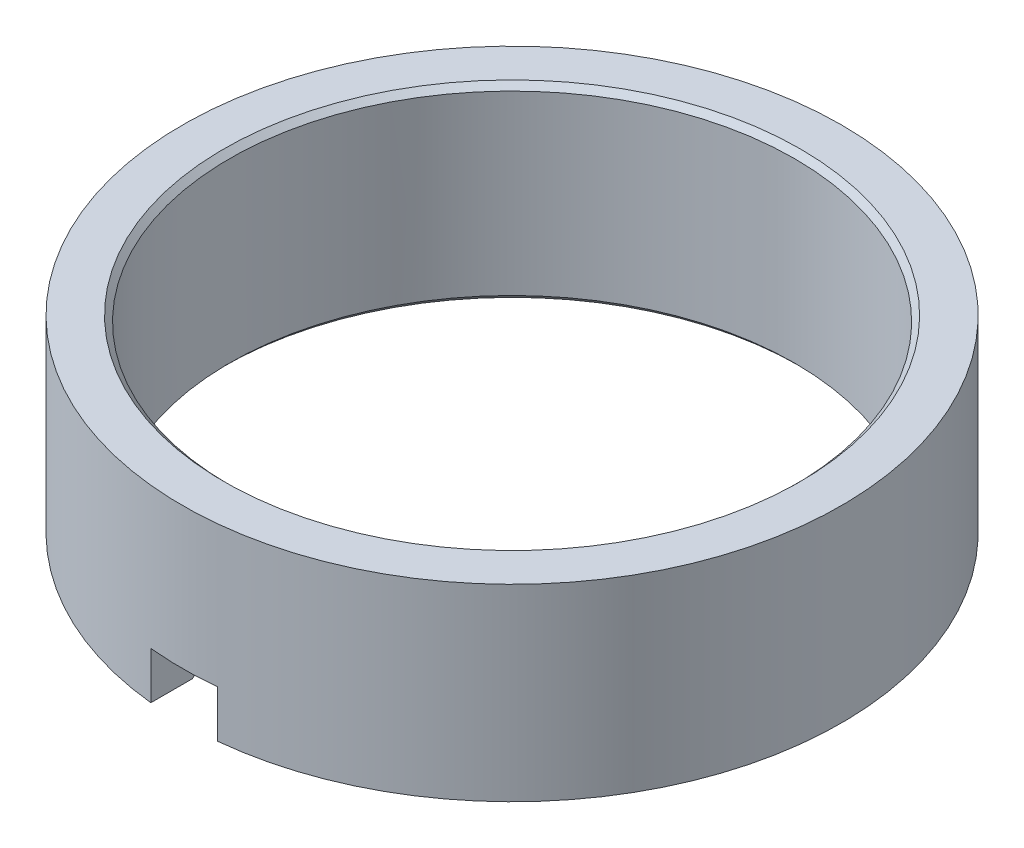
ISO-10303-21;
HEADER;
FILE_DESCRIPTION(('STEP AP214'),'2;1');
FILE_NAME('part.step','',(''),(''),'','','');
FILE_SCHEMA(('AUTOMOTIVE_DESIGN { 1 0 10303 214 1 1 1 1 }'));
ENDSEC;
DATA;
#1=APPLICATION_CONTEXT('core data for automotive mechanical design processes');
#2=APPLICATION_PROTOCOL_DEFINITION('international standard','automotive_design',2000,#1);
#3=PRODUCT_CONTEXT('',#1,'mechanical');
#4=PRODUCT('Part','Part','',(#3));
#5=PRODUCT_RELATED_PRODUCT_CATEGORY('part','',(#4));
#6=PRODUCT_DEFINITION_FORMATION('','',#4);
#7=PRODUCT_DEFINITION_CONTEXT('part definition',#1,'design');
#8=PRODUCT_DEFINITION('design','',#6,#7);
#9=PRODUCT_DEFINITION_SHAPE('','',#8);
#10=(LENGTH_UNIT() NAMED_UNIT(*) SI_UNIT(.MILLI.,.METRE.));
#11=(NAMED_UNIT(*) PLANE_ANGLE_UNIT() SI_UNIT($,.RADIAN.));
#12=(NAMED_UNIT(*) SI_UNIT($,.STERADIAN.) SOLID_ANGLE_UNIT());
#13=UNCERTAINTY_MEASURE_WITH_UNIT(LENGTH_MEASURE(1.E-05),#10,'distance_accuracy_value','');
#14=(GEOMETRIC_REPRESENTATION_CONTEXT(3) GLOBAL_UNCERTAINTY_ASSIGNED_CONTEXT((#13)) GLOBAL_UNIT_ASSIGNED_CONTEXT((#10,
#11,#12)) REPRESENTATION_CONTEXT('',''));
#15=CARTESIAN_POINT('',(0.,0.,0.));
#16=DIRECTION('',(0.,0.,1.));
#17=DIRECTION('',(1.,0.,0.));
#18=AXIS2_PLACEMENT_3D('',#15,#16,#17);
#19=CARTESIAN_POINT('',(-114.3254,-38.1,0.));
#20=DIRECTION('',(0.,1.,0.));
#21=DIRECTION('',(0.,0.,1.));
#22=AXIS2_PLACEMENT_3D('',#19,#20,#21);
#23=PLANE('',#22);
#24=DIRECTION('',(0.,0.,-1.));
#25=VECTOR('',#24,1.);
#26=CARTESIAN_POINT('',(13.4874,-38.1,0.));
#27=LINE('',#26,#25);
#28=CARTESIAN_POINT('',(13.4874,-38.1,132.666169543105));
#29=VERTEX_POINT('',#28);
#30=CARTESIAN_POINT('',(13.4874,-38.1,115.82879025182));
#31=VERTEX_POINT('',#30);
#32=EDGE_CURVE('E92',#29,#31,#27,.T.);
#33=ORIENTED_EDGE('',*,*,#32,.T.);
#34=CARTESIAN_POINT('',(0.,-38.1,0.));
#35=DIRECTION('',(0.,1.,0.));
#36=DIRECTION('',(0.,0.,1.));
#37=AXIS2_PLACEMENT_3D('',#34,#35,#36);
#38=CIRCLE('',#37,116.6114);
#39=CARTESIAN_POINT('',(-13.4874,-38.1,115.82879025182));
#40=VERTEX_POINT('',#39);
#41=EDGE_CURVE('E125',#31,#40,#38,.T.);
#42=ORIENTED_EDGE('',*,*,#41,.T.);
#43=DIRECTION('',(0.,0.,1.));
#44=VECTOR('',#43,1.);
#45=CARTESIAN_POINT('',(-13.4874,-38.1,0.));
#46=LINE('',#45,#44);
#47=CARTESIAN_POINT('',(-13.4874,-38.1,132.666169543105));
#48=VERTEX_POINT('',#47);
#49=EDGE_CURVE('E62',#40,#48,#46,.T.);
#50=ORIENTED_EDGE('',*,*,#49,.T.);
#51=CARTESIAN_POINT('',(0.,-38.1,0.));
#52=DIRECTION('',(0.,-1.,0.));
#53=DIRECTION('',(0.,0.,-1.));
#54=AXIS2_PLACEMENT_3D('',#51,#52,#53);
#55=CIRCLE('',#54,133.35);
#56=EDGE_CURVE('E107',#48,#29,#55,.T.);
#57=ORIENTED_EDGE('',*,*,#56,.T.);
#58=EDGE_LOOP('',(#33,#42,#50,#57));
#59=FACE_BOUND('',#58,.T.);
#60=ADVANCED_FACE('F45',(#59),#23,.F.);
#61=CARTESIAN_POINT('',(0.,-63.5,0.));
#62=DIRECTION('',(0.,-1.,0.));
#63=DIRECTION('',(0.,0.,-1.));
#64=AXIS2_PLACEMENT_3D('',#61,#62,#63);
#65=CYLINDRICAL_SURFACE('',#64,133.35);
#66=CARTESIAN_POINT('',(0.,38.1,0.));
#67=DIRECTION('',(0.,-1.,0.));
#68=DIRECTION('',(0.,0.,-1.));
#69=AXIS2_PLACEMENT_3D('',#66,#67,#68);
#70=CIRCLE('',#69,133.35);
#71=CARTESIAN_POINT('',(0.,38.1,-133.35));
#72=VERTEX_POINT('',#71);
#73=EDGE_CURVE('E111',#72,#72,#70,.T.);
#74=ORIENTED_EDGE('',*,*,#73,.T.);
#75=EDGE_LOOP('',(#74));
#76=FACE_BOUND('',#75,.T.);
#77=DIRECTION('',(0.,-1.,0.));
#78=VECTOR('',#77,1.);
#79=CARTESIAN_POINT('',(13.4874,-63.5,132.666169543105));
#80=LINE('',#79,#78);
#81=CARTESIAN_POINT('',(13.4874,-19.05,132.666169543105));
#82=VERTEX_POINT('',#81);
#83=EDGE_CURVE('E95',#29,#82,#80,.F.);
#84=ORIENTED_EDGE('',*,*,#83,.F.);
#85=ORIENTED_EDGE('',*,*,#56,.F.);
#86=DIRECTION('',(0.,-1.,0.));
#87=VECTOR('',#86,1.);
#88=CARTESIAN_POINT('',(-13.4874,-63.5,132.666169543105));
#89=LINE('',#88,#87);
#90=CARTESIAN_POINT('',(-13.4874,-19.05,132.666169543105));
#91=VERTEX_POINT('',#90);
#92=EDGE_CURVE('E177',#91,#48,#89,.T.);
#93=ORIENTED_EDGE('',*,*,#92,.F.);
#94=CARTESIAN_POINT('',(0.,-19.05,0.));
#95=DIRECTION('',(0.,-1.,0.));
#96=DIRECTION('',(0.,0.,-1.));
#97=AXIS2_PLACEMENT_3D('',#94,#95,#96);
#98=CIRCLE('',#97,133.35);
#99=EDGE_CURVE('E108',#82,#91,#98,.T.);
#100=ORIENTED_EDGE('',*,*,#99,.F.);
#101=EDGE_LOOP('',(#84,#85,#93,#100));
#102=FACE_BOUND('',#101,.T.);
#103=ADVANCED_FACE('F105',(#76,#102),#65,.T.);
#104=CARTESIAN_POINT('',(0.,-63.5,0.));
#105=DIRECTION('',(0.,-1.,0.));
#106=DIRECTION('',(0.,0.,-1.));
#107=AXIS2_PLACEMENT_3D('',#104,#105,#106);
#108=CYLINDRICAL_SURFACE('',#107,114.3254);
#109=CARTESIAN_POINT('',(0.,35.8139999999999,0.));
#110=DIRECTION('',(0.,-1.,0.));
#111=DIRECTION('',(0.,0.,-1.));
#112=AXIS2_PLACEMENT_3D('',#109,#110,#111);
#113=CIRCLE('',#112,114.3254);
#114=CARTESIAN_POINT('',(0.,35.8139999999999,-114.3254));
#115=VERTEX_POINT('',#114);
#116=EDGE_CURVE('E122',#115,#115,#113,.F.);
#117=ORIENTED_EDGE('',*,*,#116,.T.);
#118=EDGE_LOOP('',(#117));
#119=FACE_BOUND('',#118,.T.);
#120=DIRECTION('',(0.,-1.,0.));
#121=VECTOR('',#120,1.);
#122=CARTESIAN_POINT('',(13.4874,-63.5,113.52703257991));
#123=LINE('',#122,#121);
#124=CARTESIAN_POINT('',(13.4874,-19.05,113.52703257991));
#125=VERTEX_POINT('',#124);
#126=CARTESIAN_POINT('',(13.4874,-35.8139999999999,113.52703257991));
#127=VERTEX_POINT('',#126);
#128=EDGE_CURVE('E70',#125,#127,#123,.T.);
#129=ORIENTED_EDGE('',*,*,#128,.F.);
#130=CARTESIAN_POINT('',(0.,-19.05,0.));
#131=DIRECTION('',(0.,-1.,0.));
#132=DIRECTION('',(0.,0.,-1.));
#133=AXIS2_PLACEMENT_3D('',#130,#131,#132);
#134=CIRCLE('',#133,114.3254);
#135=CARTESIAN_POINT('',(-13.4874,-19.05,113.52703257991));
#136=VERTEX_POINT('',#135);
#137=EDGE_CURVE('E11',#136,#125,#134,.F.);
#138=ORIENTED_EDGE('',*,*,#137,.F.);
#139=DIRECTION('',(0.,-1.,0.));
#140=VECTOR('',#139,1.);
#141=CARTESIAN_POINT('',(-13.4874,-63.5,113.52703257991));
#142=LINE('',#141,#140);
#143=CARTESIAN_POINT('',(-13.4874,-35.8139999999999,113.52703257991));
#144=VERTEX_POINT('',#143);
#145=EDGE_CURVE('E179',#144,#136,#142,.F.);
#146=ORIENTED_EDGE('',*,*,#145,.F.);
#147=CARTESIAN_POINT('',(0.,-35.8139999999999,0.));
#148=DIRECTION('',(0.,1.,0.));
#149=DIRECTION('',(0.,0.,1.));
#150=AXIS2_PLACEMENT_3D('',#147,#148,#149);
#151=CIRCLE('',#150,114.3254);
#152=EDGE_CURVE('E114',#144,#127,#151,.F.);
#153=ORIENTED_EDGE('',*,*,#152,.T.);
#154=EDGE_LOOP('',(#129,#138,#146,#153));
#155=FACE_BOUND('',#154,.T.);
#156=ADVANCED_FACE('F146',(#119,#155),#108,.F.);
#157=CARTESIAN_POINT('',(0.,-35.8139999999999,0.));
#158=DIRECTION('',(0.,-1.,0.));
#159=DIRECTION('',(0.,0.,-1.));
#160=AXIS2_PLACEMENT_3D('',#157,#158,#159);
#161=CONICAL_SURFACE('',#160,114.3254,0.785398163397454);
#162=ORIENTED_EDGE('',*,*,#41,.F.);
#163=CARTESIAN_POINT('',(13.4874,-154.734004730704,232.855124206513));
#164=CARTESIAN_POINT('',(13.4874,-150.783306227103,228.897800791618));
#165=CARTESIAN_POINT('',(13.4874,-146.832772893592,224.94031247727));
#166=CARTESIAN_POINT('',(13.4874,-138.932101825906,217.024940736671));
#167=CARTESIAN_POINT('',(13.4874,-134.981964091744,213.067057310407));
#168=CARTESIAN_POINT('',(13.4874,-123.132146557052,201.19262057548));
#169=CARTESIAN_POINT('',(13.4874,-115.23315844091,193.275376981933));
#170=CARTESIAN_POINT('',(13.4874,-99.435655904682,177.436123165166));
#171=CARTESIAN_POINT('',(13.4874,-91.5371421970808,169.514112231245));
#172=CARTESIAN_POINT('',(13.4874,-79.6924009431494,157.628169552292));
#173=CARTESIAN_POINT('',(13.4874,-75.7446818781519,153.665724185155));
#174=CARTESIAN_POINT('',(13.4874,-67.8505063106045,145.739578018422));
#175=CARTESIAN_POINT('',(13.4874,-63.9040498077181,141.775877219161));
#176=CARTESIAN_POINT('',(13.4874,-55.8711285886484,133.704578006174));
#177=CARTESIAN_POINT('',(13.4874,-51.784722702562,129.596921038157));
#178=CARTESIAN_POINT('',(13.4874,-43.6141885995613,121.379333818063));
#179=CARTESIAN_POINT('',(13.4874,-39.5300603849835,117.269403563663));
#180=CARTESIAN_POINT('',(13.4874,-31.3647597146804,109.046308919736));
#181=CARTESIAN_POINT('',(13.4874,-27.2835873726008,104.93314441735));
#182=CARTESIAN_POINT('',(13.4874,-19.1256116030581,96.7025130745335));
#183=CARTESIAN_POINT('',(13.4874,-15.0488081597221,92.5850462498418));
#184=CARTESIAN_POINT('',(13.4874,-8.93879955870933,86.4044135691978));
#185=CARTESIAN_POINT('',(13.4874,-6.90317207712611,84.3436424858579));
#186=CARTESIAN_POINT('',(13.4874,-2.83393731714736,80.2201067001221));
#187=CARTESIAN_POINT('',(13.4874,-0.800330038637004,78.1573419978394));
#188=CARTESIAN_POINT('',(13.4874,3.26437600555867,74.0292822938904));
#189=CARTESIAN_POINT('',(13.4874,5.29547473405966,71.9639872555997));
#190=CARTESIAN_POINT('',(13.4874,8.33966708476196,68.8636356285423));
#191=CARTESIAN_POINT('',(13.4874,9.35398804264273,67.8297841215373));
#192=CARTESIAN_POINT('',(13.4874,11.3816897272019,65.7611581265697));
#193=CARTESIAN_POINT('',(13.4874,12.3950704532538,64.726383637993));
#194=CARTESIAN_POINT('',(13.4874,15.4334684578854,61.6206144009531));
#195=CARTESIAN_POINT('',(13.4874,17.4568724473857,59.5480406496921));
#196=CARTESIAN_POINT('',(13.4874,21.4978909600851,55.3972569043069));
#197=CARTESIAN_POINT('',(13.4874,23.515505490552,53.3190469172644));
#198=CARTESIAN_POINT('',(13.4874,26.535796326691,50.1958464898754));
#199=CARTESIAN_POINT('',(13.4874,27.5415272413634,49.1538101024789));
#200=CARTESIAN_POINT('',(13.4874,29.5505248402633,47.0673650331691));
#201=CARTESIAN_POINT('',(13.4874,30.5537915261667,46.02295635287));
#202=CARTESIAN_POINT('',(13.4874,32.557325418996,43.9312785625414));
#203=CARTESIAN_POINT('',(13.4874,33.5575926458461,42.8840094716011));
#204=CARTESIAN_POINT('',(13.4874,35.5544366020842,40.7859599271183));
#205=CARTESIAN_POINT('',(13.4874,36.5510133391921,39.7351794809298));
#206=CARTESIAN_POINT('',(13.4874,37.8125336994979,38.399171689328));
#207=CARTESIAN_POINT('',(13.4874,38.079626553293,38.1159728760801));
#208=CARTESIAN_POINT('',(13.4874,38.6134538387754,37.5492372091962));
#209=CARTESIAN_POINT('',(13.4874,38.8801882701821,37.2657003552959));
#210=CARTESIAN_POINT('',(13.4874,39.6798197596355,36.4145504597994));
#211=CARTESIAN_POINT('',(13.4874,40.2121440902676,35.8463990612159));
#212=CARTESIAN_POINT('',(13.4874,41.2750534074583,34.7084548493509));
#213=CARTESIAN_POINT('',(13.4874,41.8056383670644,34.1386620108888));
#214=CARTESIAN_POINT('',(13.4874,42.8647953272733,32.9972082448155));
#215=CARTESIAN_POINT('',(13.4874,43.3933673286189,32.4255473178936));
#216=CARTESIAN_POINT('',(13.4874,44.4463160867135,31.2820957546902));
#217=CARTESIAN_POINT('',(13.4874,44.9707010654061,30.7103126926346));
#218=CARTESIAN_POINT('',(13.4874,46.0167622920154,29.5642744105434));
#219=CARTESIAN_POINT('',(13.4874,46.5384385436055,28.9900191938625));
#220=CARTESIAN_POINT('',(13.4874,47.5785853702535,27.8386428551079));
#221=CARTESIAN_POINT('',(13.4874,48.0970560430975,27.2615218214339));
#222=CARTESIAN_POINT('',(13.4874,49.1301991483985,26.103891546275));
#223=CARTESIAN_POINT('',(13.4874,49.6448715930555,25.5233823156838));
#224=CARTESIAN_POINT('',(13.4874,50.8434732587169,24.1607577651203));
#225=CARTESIAN_POINT('',(13.4874,51.5255962013884,23.3770509118857));
#226=CARTESIAN_POINT('',(13.4874,52.8792924607404,21.8004297460179));
#227=CARTESIAN_POINT('',(13.4874,53.5508648766172,21.0075146571301));
#228=CARTESIAN_POINT('',(13.4874,54.5497200984334,19.8066060257042));
#229=CARTESIAN_POINT('',(13.4874,54.8823286253909,19.4030411163719));
#230=CARTESIAN_POINT('',(13.4874,55.5432938356535,18.5924470309747));
#231=CARTESIAN_POINT('',(13.4874,55.8716505658318,18.1854178931826));
#232=CARTESIAN_POINT('',(13.4874,56.5232735596788,17.3674648318092));
#233=CARTESIAN_POINT('',(13.4874,56.8465410644358,16.9565418982108));
#234=CARTESIAN_POINT('',(13.4874,57.4871104763211,16.1300650770537));
#235=CARTESIAN_POINT('',(13.4874,57.804412387048,15.7145111922887));
#236=CARTESIAN_POINT('',(13.4874,58.4360053006716,14.8724613013077));
#237=CARTESIAN_POINT('',(13.4874,58.7502004881337,14.4458932691237));
#238=CARTESIAN_POINT('',(13.4874,59.3696213187082,13.5862646439058));
#239=CARTESIAN_POINT('',(13.4874,59.6748468022375,13.1532039355651));
#240=CARTESIAN_POINT('',(13.4874,60.2746610248018,12.2788458800381));
#241=CARTESIAN_POINT('',(13.4874,60.569234037144,11.837537705749));
#242=CARTESIAN_POINT('',(13.4874,61.1445326515099,10.9459650614538));
#243=CARTESIAN_POINT('',(13.4874,61.4252587206737,10.4957008943071));
#244=CARTESIAN_POINT('',(13.4874,61.9667018504888,9.58895834565555));
#245=CARTESIAN_POINT('',(13.4874,62.2275819109942,9.13257788449156));
#246=CARTESIAN_POINT('',(13.4874,62.7276246720978,8.20785788174897));
#247=CARTESIAN_POINT('',(13.4874,62.9667830228176,7.73951596878378));
#248=CARTESIAN_POINT('',(13.4874,63.4167031913037,6.79071856673341));
#249=CARTESIAN_POINT('',(13.4874,63.6275365228177,6.31029736398068));
#250=CARTESIAN_POINT('',(13.4874,64.0138536631907,5.33562071215081));
#251=CARTESIAN_POINT('',(13.4874,64.1893606573905,4.84137458087585));
#252=CARTESIAN_POINT('',(13.4874,64.4831876727242,3.88208177638204));
#253=CARTESIAN_POINT('',(13.4874,64.6051209922509,3.41816553253433));
#254=CARTESIAN_POINT('',(13.4874,64.7552881842329,2.71535879048671));
#255=CARTESIAN_POINT('',(13.4874,64.79989168907,2.47990706964517));
#256=CARTESIAN_POINT('',(13.4874,64.8774673949524,2.0071079587459));
#257=CARTESIAN_POINT('',(13.4874,64.9104413120674,1.76976085366261));
#258=CARTESIAN_POINT('',(13.4874,64.9640300373658,1.29486225406664));
#259=CARTESIAN_POINT('',(13.4874,64.9847052428358,1.05731759274758));
#260=CARTESIAN_POINT('',(13.4874,65.0135605151602,0.581467309936225));
#261=CARTESIAN_POINT('',(13.4874,65.0217406821055,0.343161694554848));
#262=CARTESIAN_POINT('',(13.4874,65.0254449543282,-0.133554319038558));
#263=CARTESIAN_POINT('',(13.4874,65.0209687447507,-0.371964719709828));
#264=CARTESIAN_POINT('',(13.4874,64.9994485399841,-0.848214472698873));
#265=CARTESIAN_POINT('',(13.4874,64.9824045035531,-1.08605382314015));
#266=CARTESIAN_POINT('',(13.4874,64.9361902367557,-1.55934013513394));
#267=CARTESIAN_POINT('',(13.4874,64.9070814411429,-1.79479311285263));
#268=CARTESIAN_POINT('',(13.4874,64.8372741408127,-2.26398685707855));
#269=CARTESIAN_POINT('',(13.4874,64.7965739823162,-2.49772737437865));
#270=CARTESIAN_POINT('',(13.4874,64.6580773737701,-3.19566045308936));
#271=CARTESIAN_POINT('',(13.4874,64.5438751248721,-3.65665883437924));
#272=CARTESIAN_POINT('',(13.4874,64.2773438287674,-4.5706951412174));
#273=CARTESIAN_POINT('',(13.4874,64.1247588206933,-5.02365684749696));
#274=CARTESIAN_POINT('',(13.4874,63.8727210263734,-5.69419361629786));
#275=CARTESIAN_POINT('',(13.4874,63.7848495332518,-5.91621905381325));
#276=CARTESIAN_POINT('',(13.4874,63.602141511282,-6.35738422347281));
#277=CARTESIAN_POINT('',(13.4874,63.5073050916052,-6.57652400078464));
#278=CARTESIAN_POINT('',(13.4874,63.2356489144885,-7.18036253732351));
#279=CARTESIAN_POINT('',(13.4874,63.0521382118852,-7.56205671722232));
#280=CARTESIAN_POINT('',(13.4874,62.6689982095017,-8.31731064279733));
#281=CARTESIAN_POINT('',(13.4874,62.4693649695506,-8.69086837152017));
#282=CARTESIAN_POINT('',(13.4874,62.0566746778976,-9.43093061311275));
#283=CARTESIAN_POINT('',(13.4874,61.8436050158289,-9.79742806572377));
#284=CARTESIAN_POINT('',(13.4874,61.4065477351534,-10.5237891018354));
#285=CARTESIAN_POINT('',(13.4874,61.1825609360093,-10.8836531804646));
#286=CARTESIAN_POINT('',(13.4874,60.7246723825044,-11.5988553366855));
#287=CARTESIAN_POINT('',(13.4874,60.4907373848526,-11.9541720674442));
#288=CARTESIAN_POINT('',(13.4874,60.015219415468,-12.6596452356517));
#289=CARTESIAN_POINT('',(13.4874,59.7736363262591,-13.0098015937152));
#290=CARTESIAN_POINT('',(13.4874,59.2841526513077,-13.7054043195525));
#291=CARTESIAN_POINT('',(13.4874,59.0362552252207,-14.0508529151983));
#292=CARTESIAN_POINT('',(13.4874,58.5349968225227,-14.7377698512544));
#293=CARTESIAN_POINT('',(13.4874,58.2816357076663,-15.0792380906139));
#294=CARTESIAN_POINT('',(13.4874,57.7678696804482,-15.761822863937));
#295=CARTESIAN_POINT('',(13.4874,57.5074211510117,-16.1029065273303));
#296=CARTESIAN_POINT('',(13.4874,56.9824349111018,-16.7819149710698));
#297=CARTESIAN_POINT('',(13.4874,56.7178971440498,-17.1198397076051));
#298=CARTESIAN_POINT('',(13.4874,55.9189644970031,-18.1294795516225));
#299=CARTESIAN_POINT('',(13.4874,55.3792848323579,-18.7970146874378));
#300=CARTESIAN_POINT('',(13.4874,54.2905256114602,-20.121692729743));
#301=CARTESIAN_POINT('',(13.4874,53.7414713493505,-20.778856507314));
#302=CARTESIAN_POINT('',(13.4874,52.9116600186761,-21.7592941798184));
#303=CARTESIAN_POINT('',(13.4874,52.6340231300999,-22.0852160712655));
#304=CARTESIAN_POINT('',(13.4874,52.0768905093923,-22.7354668726079));
#305=CARTESIAN_POINT('',(13.4874,51.7973947785806,-23.0597957836339));
#306=CARTESIAN_POINT('',(13.4874,50.9687956590274,-24.0163540675692));
#307=CARTESIAN_POINT('',(13.4874,50.4173552516385,-24.6465596884291));
#308=CARTESIAN_POINT('',(13.4874,49.3093495642465,-25.9024530448257));
#309=CARTESIAN_POINT('',(13.4874,48.7527842341615,-26.5281407361052));
#310=CARTESIAN_POINT('',(13.4874,47.635421505325,-27.7757650750315));
#311=CARTESIAN_POINT('',(13.4874,47.074623951192,-28.3977015834346));
#312=CARTESIAN_POINT('',(13.4874,45.9495225396311,-29.6383890494512));
#313=CARTESIAN_POINT('',(13.4874,45.3852186922582,-30.2571400161905));
#314=CARTESIAN_POINT('',(13.4874,43.6877580992334,-32.1095239303715));
#315=CARTESIAN_POINT('',(13.4874,42.5501999925515,-33.3391236157097));
#316=CARTESIAN_POINT('',(13.4874,40.2665886869108,-35.7904090101791));
#317=CARTESIAN_POINT('',(13.4874,39.1205354282992,-37.012094663625));
#318=CARTESIAN_POINT('',(13.4874,37.395983220289,-38.8408092206915));
#319=CARTESIAN_POINT('',(13.4874,36.8198811730589,-39.4501010684048));
#320=CARTESIAN_POINT('',(13.4874,35.6662691157905,-40.667345903809));
#321=CARTESIAN_POINT('',(13.4874,35.0887591112536,-41.2752988967139));
#322=CARTESIAN_POINT('',(13.4874,33.3543722393845,-43.09740296489));
#323=CARTESIAN_POINT('',(13.4874,32.1956446938416,-44.3097925839734));
#324=CARTESIAN_POINT('',(13.4874,29.8744181994633,-46.7307612886478));
#325=CARTESIAN_POINT('',(13.4874,28.7119195698038,-47.9393406804911));
#326=CARTESIAN_POINT('',(13.4874,26.3838243754579,-50.35351216724));
#327=CARTESIAN_POINT('',(13.4874,25.2182278094314,-51.5591042608527));
#328=CARTESIAN_POINT('',(13.4874,22.8938648245349,-53.9582040350579));
#329=CARTESIAN_POINT('',(13.4874,21.7351184743397,-55.1517311649417));
#330=CARTESIAN_POINT('',(13.4874,19.4155797571326,-57.5367959051009));
#331=CARTESIAN_POINT('',(13.4874,18.254787389456,-58.7283335147297));
#332=CARTESIAN_POINT('',(13.4874,14.7698207677211,-62.3005117853793));
#333=CARTESIAN_POINT('',(13.4874,12.4431027417542,-64.678670728555));
#334=CARTESIAN_POINT('',(13.4874,7.78577906613325,-69.4292567784401));
#335=CARTESIAN_POINT('',(13.4874,5.45517541040936,-71.8016858412214));
#336=CARTESIAN_POINT('',(13.4874,0.790372469186974,-76.5429801294239));
#337=CARTESIAN_POINT('',(13.4874,-1.54382679659001,-78.9118453742524));
#338=CARTESIAN_POINT('',(13.4874,-6.7838576510692,-84.2235336998939));
#339=CARTESIAN_POINT('',(13.4874,-9.69043935578732,-87.1656166425051));
#340=CARTESIAN_POINT('',(13.4874,-15.5070548950988,-93.0470238743681));
#341=CARTESIAN_POINT('',(13.4874,-18.417089082143,-95.9863478149682));
#342=CARTESIAN_POINT('',(13.4874,-24.2550122943202,-101.878287256324));
#343=CARTESIAN_POINT('',(13.4874,-27.1829139317867,-104.83089025843));
#344=CARTESIAN_POINT('',(13.4874,-33.0402639496373,-110.733891354194));
#345=CARTESIAN_POINT('',(13.4874,-35.9697121147197,-113.684289661478));
#346=CARTESIAN_POINT('',(13.4874,-38.8998474096153,-116.634004730704));
#347=B_SPLINE_CURVE_WITH_KNOTS('',3,(#163,#164,#165,#166,#167,#168,#169,#170,#171,#172,#173,
#174,#175,#176,#177,#178,#179,#180,#181,#182,#183,#184,#185,#186,#187,#188,#189,#190,#191,#192,
#193,#194,#195,#196,#197,#198,#199,#200,#201,#202,#203,#204,#205,#206,#207,#208,#209,#210,#211,
#212,#213,#214,#215,#216,#217,#218,#219,#220,#221,#222,#223,#224,#225,#226,#227,#228,#229,#230,
#231,#232,#233,#234,#235,#236,#237,#238,#239,#240,#241,#242,#243,#244,#245,#246,#247,#248,#249,
#250,#251,#252,#253,#254,#255,#256,#257,#258,#259,#260,#261,#262,#263,#264,#265,#266,#267,#268,
#269,#270,#271,#272,#273,#274,#275,#276,#277,#278,#279,#280,#281,#282,#283,#284,#285,#286,#287,
#288,#289,#290,#291,#292,#293,#294,#295,#296,#297,#298,#299,#300,#301,#302,#303,#304,#305,#306,
#307,#308,#309,#310,#311,#312,#313,#314,#315,#316,#317,#318,#319,#320,#321,#322,#323,#324,#325,
#326,#327,#328,#329,#330,#331,#332,#333,#334,#335,#336,#337,#338,#339,#340,#341,#342,#343,#344,
#345,#346),.UNSPECIFIED.,.F.,.F.,(4,2,2,2,2,2,2,2,2,2,2,2,2,2,2,2,2,2,2,2,2,2,2,2,2,2,2,2,2,2,2,
2,2,2,2,2,2,2,2,2,2,2,2,2,2,2,2,2,2,2,2,2,2,2,2,2,2,2,2,2,2,2,2,2,2,2,2,2,2,2,2,2,2,2,2,2,2,2,2,
2,2,2,2,2,2,2,2,2,2,2,2,4),(0.,16.7754536581754,33.5509078460267,67.102223913849,
100.662660607065,117.442682205294,134.222699327617,151.604989377127,168.987297223784,
186.370241230576,203.753121866283,212.443058092003,221.132993823682,229.823056856686,
234.168083781137,238.513113599123,247.202612939477,255.892101366705,260.236751372987,
264.581398423892,268.926016550837,273.270625584208,274.438470131733,275.606315592991,
277.942010546488,280.277741523504,282.613471638612,284.940960584767,287.268446373647,
289.595860808784,291.923267764891,295.040153084832,298.157303093708,299.726177246661,
301.295034089056,302.863502221741,304.431969408265,306.02124824367,307.610555337401,
309.202120222435,310.793631377699,312.370212553138,313.947108753736,315.519945697875,
317.091746969151,318.528764578313,319.247438305963,319.966005941223,320.681015016018,
321.39601836323,322.111039497863,322.826062978883,323.537489381963,324.249017337568,
325.671790083016,327.104314696032,327.820560409065,328.536794897739,329.806841089226,
331.077198610794,332.348766664557,333.620239418367,334.896358848275,336.172497889127,
337.448010438463,338.723555299488,340.010975304043,341.298413137249,343.873460432652,
346.442408080535,347.726834223039,349.011259453703,351.523433614619,354.035632351215,
356.547923773581,359.060207994746,364.085439120641,369.110705567037,371.626289264989,
374.141863149215,379.173037923859,384.203797438123,389.234559129097,394.225027239218,
399.215496970886,409.196633540428,419.173662554717,429.15063703959,441.557753629207,
453.966269889942,466.440813136147,478.91392909322),.UNSPECIFIED.);
#348=EDGE_CURVE('E55',#31,#127,#347,.T.);
#349=ORIENTED_EDGE('',*,*,#348,.T.);
#350=ORIENTED_EDGE('',*,*,#152,.F.);
#351=CARTESIAN_POINT('',(-13.4874,-38.8998474096153,-116.634004730704));
#352=CARTESIAN_POINT('',(-13.4874,-37.3334828317347,-115.057199541472));
#353=CARTESIAN_POINT('',(-13.4874,-35.7673266104061,-113.480187366134));
#354=CARTESIAN_POINT('',(-13.4874,-32.6354917494456,-110.325687395638));
#355=CARTESIAN_POINT('',(-13.4874,-31.0698131100392,-108.748199600256));
#356=CARTESIAN_POINT('',(-13.4874,-26.3729902856855,-104.014331038644));
#357=CARTESIAN_POINT('',(-13.4874,-23.2426564022265,-100.857146191457));
#358=CARTESIAN_POINT('',(-13.4874,-16.9722593039628,-94.5272868380065));
#359=CARTESIAN_POINT('',(-13.4874,-13.8322074889674,-91.35460103618));
#360=CARTESIAN_POINT('',(-13.4874,-9.12533842452391,-86.5929854508427));
#361=CARTESIAN_POINT('',(-13.4874,-7.55706288237313,-85.0054972058659));
#362=CARTESIAN_POINT('',(-13.4874,-4.42167292682954,-81.8293890464668));
#363=CARTESIAN_POINT('',(-13.4874,-2.85455850805352,-80.240769137359));
#364=CARTESIAN_POINT('',(-13.4874,1.17755478406773,-76.1498062136203));
#365=CARTESIAN_POINT('',(-13.4874,3.64154393589919,-73.6464677535382));
#366=CARTESIAN_POINT('',(-13.4874,8.56504240786121,-68.6352805585237));
#367=CARTESIAN_POINT('',(-13.4874,11.0245516301276,-66.1274317273851));
#368=CARTESIAN_POINT('',(-13.4874,14.7099164015938,-62.3601366399749));
#369=CARTESIAN_POINT('',(-13.4874,15.93814714957,-61.1030139698593));
#370=CARTESIAN_POINT('',(-13.4874,18.3926964448373,-58.5869034484075));
#371=CARTESIAN_POINT('',(-13.4874,19.6190149926279,-57.3279155975585));
#372=CARTESIAN_POINT('',(-13.4874,22.069241054341,-54.8077932294101));
#373=CARTESIAN_POINT('',(-13.4874,23.2931487550175,-53.5466588937262));
#374=CARTESIAN_POINT('',(-13.4874,25.7381248408737,-51.0216438564329));
#375=CARTESIAN_POINT('',(-13.4874,26.9591932305107,-49.7577631591408));
#376=CARTESIAN_POINT('',(-13.4874,29.3931332244616,-47.2314342281612));
#377=CARTESIAN_POINT('',(-13.4874,30.6060183180458,-45.9689989954233));
#378=CARTESIAN_POINT('',(-13.4874,33.0273552335893,-43.4398659862809));
#379=CARTESIAN_POINT('',(-13.4874,34.2358070271941,-42.1731681827128));
#380=CARTESIAN_POINT('',(-13.4874,36.6473520186931,-39.6339091928487));
#381=CARTESIAN_POINT('',(-13.4874,37.8504433814535,-38.3613462627513));
#382=CARTESIAN_POINT('',(-13.4874,40.2490088349541,-35.8090992685306));
#383=CARTESIAN_POINT('',(-13.4874,41.4444830844418,-34.5294153538633));
#384=CARTESIAN_POINT('',(-13.4874,43.2290675381029,-32.6035381933153));
#385=CARTESIAN_POINT('',(-13.4874,43.822085356985,-31.9609657475553));
#386=CARTESIAN_POINT('',(-13.4874,45.0050301245127,-30.6729831292831));
#387=CARTESIAN_POINT('',(-13.4874,45.5949570808206,-30.0275729638129));
#388=CARTESIAN_POINT('',(-13.4874,46.7711778047475,-28.7333367354544));
#389=CARTESIAN_POINT('',(-13.4874,47.3574712231678,-28.0845103550047));
#390=CARTESIAN_POINT('',(-13.4874,48.5255933036032,-26.7828516983718));
#391=CARTESIAN_POINT('',(-13.4874,49.1074219825073,-26.1300194373586));
#392=CARTESIAN_POINT('',(-13.4874,50.2652906557741,-24.8198847602722));
#393=CARTESIAN_POINT('',(-13.4874,50.8413336972863,-24.1625850400174));
#394=CARTESIAN_POINT('',(-13.4874,51.9866472022365,-22.8420804975354));
#395=CARTESIAN_POINT('',(-13.4874,52.5559175436081,-22.1788755692523));
#396=CARTESIAN_POINT('',(-13.4874,53.6857850939774,-20.8453038450334));
#397=CARTESIAN_POINT('',(-13.4874,54.2463837682693,-20.1749382921543));
#398=CARTESIAN_POINT('',(-13.4874,55.356531869191,-18.8251334758035));
#399=CARTESIAN_POINT('',(-13.4874,55.9060818626219,-18.1456946807834));
#400=CARTESIAN_POINT('',(-13.4874,56.5500671870824,-17.3319443466591));
#401=CARTESIAN_POINT('',(-13.4874,56.6515421201199,-17.2031916626642));
#402=CARTESIAN_POINT('',(-13.4874,56.853946464354,-16.9452571717444));
#403=CARTESIAN_POINT('',(-13.4874,56.9548758732174,-16.8160753629879));
#404=CARTESIAN_POINT('',(-13.4874,57.2568046204567,-16.4278524514592));
#405=CARTESIAN_POINT('',(-13.4874,57.4569405321473,-16.1681388467791));
#406=CARTESIAN_POINT('',(-13.4874,57.8546457776528,-15.6467242280713));
#407=CARTESIAN_POINT('',(-13.4874,58.0522149384949,-15.3850230819674));
#408=CARTESIAN_POINT('',(-13.4874,58.4444434249078,-14.8594527923701));
#409=CARTESIAN_POINT('',(-13.4874,58.6391027602115,-14.5955836561328));
#410=CARTESIAN_POINT('',(-13.4874,59.2191895746218,-13.7990025898774));
#411=CARTESIAN_POINT('',(-13.4874,59.5996861050346,-13.2626730429868));
#412=CARTESIAN_POINT('',(-13.4874,60.3436692554017,-12.1783446201142));
#413=CARTESIAN_POINT('',(-13.4874,60.7071568381573,-11.630346407205));
#414=CARTESIAN_POINT('',(-13.4874,61.4002642412733,-10.5381905780418));
#415=CARTESIAN_POINT('',(-13.4874,61.7306031632363,-9.99449429377072));
#416=CARTESIAN_POINT('',(-13.4874,62.2052709886675,-9.16682923490618));
#417=CARTESIAN_POINT('',(-13.4874,62.3600563941405,-8.88884950018497));
#418=CARTESIAN_POINT('',(-13.4874,62.6615203172503,-8.32853871403166));
#419=CARTESIAN_POINT('',(-13.4874,62.8081993792336,-8.04620795640579));
#420=CARTESIAN_POINT('',(-13.4874,63.0915881616125,-7.47803343566651));
#421=CARTESIAN_POINT('',(-13.4874,63.2283370746767,-7.19220934614374));
#422=CARTESIAN_POINT('',(-13.4874,63.4910445116066,-6.61566277518688));
#423=CARTESIAN_POINT('',(-13.4874,63.6170026111698,-6.32494010167439));
#424=CARTESIAN_POINT('',(-13.4874,63.9759576649155,-5.4456542628646));
#425=CARTESIAN_POINT('',(-13.4874,64.1904316869844,-4.84919780852031));
#426=CARTESIAN_POINT('',(-13.4874,64.489294239724,-3.85325940359821));
#427=CARTESIAN_POINT('',(-13.4874,64.5927876782716,-3.45948638241506));
#428=CARTESIAN_POINT('',(-13.4874,64.7687082825751,-2.66488347679966));
#429=CARTESIAN_POINT('',(-13.4874,64.841131675918,-2.26405274159249));
#430=CARTESIAN_POINT('',(-13.4874,64.9511349369829,-1.45913360853476));
#431=CARTESIAN_POINT('',(-13.4874,64.9888466941413,-1.05506347529417));
#432=CARTESIAN_POINT('',(-13.4874,65.0278353896435,-0.245155686968366));
#433=CARTESIAN_POINT('',(-13.4874,65.0291139448402,0.160681888880853));
#434=CARTESIAN_POINT('',(-13.4874,64.9951658489899,0.970803101390786));
#435=CARTESIAN_POINT('',(-13.4874,64.9599390502102,1.37508673175623));
#436=CARTESIAN_POINT('',(-13.4874,64.8549199188758,2.179096735691));
#437=CARTESIAN_POINT('',(-13.4874,64.7851251704732,2.57882278874755));
#438=CARTESIAN_POINT('',(-13.4874,64.614013649827,3.37322105425839));
#439=CARTESIAN_POINT('',(-13.4874,64.5125595115549,3.76786328547401));
#440=CARTESIAN_POINT('',(-13.4874,64.2824081883104,4.54902804259092));
#441=CARTESIAN_POINT('',(-13.4874,64.1537103878943,4.93555038484427));
#442=CARTESIAN_POINT('',(-13.4874,63.8418659441136,5.78574974283723));
#443=CARTESIAN_POINT('',(-13.4874,63.652980503404,6.24730920916288));
#444=CARTESIAN_POINT('',(-13.4874,63.2475927572515,7.15823847909015));
#445=CARTESIAN_POINT('',(-13.4874,63.0310770663654,7.60760224569137));
#446=CARTESIAN_POINT('',(-13.4874,62.5757833019016,8.49585789016583));
#447=CARTESIAN_POINT('',(-13.4874,62.3369652407643,8.93472911513344));
#448=CARTESIAN_POINT('',(-13.4874,61.8419584276739,9.80240987303087));
#449=CARTESIAN_POINT('',(-13.4874,61.5857722822292,10.2312209027959));
#450=CARTESIAN_POINT('',(-13.4874,61.0576271202563,11.0831722509207));
#451=CARTESIAN_POINT('',(-13.4874,60.7855695303241,11.5062511739087));
#452=CARTESIAN_POINT('',(-13.4874,60.2300749710232,12.3448580682788));
#453=CARTESIAN_POINT('',(-13.4874,59.9466376887146,12.760385831548));
#454=CARTESIAN_POINT('',(-13.4874,59.3708260146974,13.584491285864));
#455=CARTESIAN_POINT('',(-13.4874,59.0784620337074,13.9930762684232));
#456=CARTESIAN_POINT('',(-13.4874,58.6342173334875,14.6017676049129));
#457=CARTESIAN_POINT('',(-13.4874,58.4851878848372,14.8039645160357));
#458=CARTESIAN_POINT('',(-13.4874,58.1853908609849,15.207065541373));
#459=CARTESIAN_POINT('',(-13.4874,58.0346232879167,15.4079696571739));
#460=CARTESIAN_POINT('',(-13.4874,57.5456026089675,16.0542782099102));
#461=CARTESIAN_POINT('',(-13.4874,57.204217703388,16.4973156216998));
#462=CARTESIAN_POINT('',(-13.4874,56.5149958065293,17.3783506870517));
#463=CARTESIAN_POINT('',(-13.4874,56.1671586150481,17.8163481835495));
#464=CARTESIAN_POINT('',(-13.4874,55.4660806616318,18.688067818006));
#465=CARTESIAN_POINT('',(-13.4874,55.1128393385857,19.121789504213));
#466=CARTESIAN_POINT('',(-13.4874,54.4018408210496,19.9855194766723));
#467=CARTESIAN_POINT('',(-13.4874,54.0440835729136,20.415527718709));
#468=CARTESIAN_POINT('',(-13.4874,53.3245881880215,21.2725115270557));
#469=CARTESIAN_POINT('',(-13.4874,52.9628484148668,21.6994857183554));
#470=CARTESIAN_POINT('',(-13.4874,52.2360873492992,22.5506337085253));
#471=CARTESIAN_POINT('',(-13.4874,51.8710660375949,22.9748074909072));
#472=CARTESIAN_POINT('',(-13.4874,50.7718272986805,24.2436166161816));
#473=CARTESIAN_POINT('',(-13.4874,50.0333881122103,25.0845954163803));
#474=CARTESIAN_POINT('',(-13.4874,48.5468275044231,26.7603255830597));
#475=CARTESIAN_POINT('',(-13.4874,47.7986925381566,27.5950649011453));
#476=CARTESIAN_POINT('',(-13.4874,46.2957821604017,29.2585567091438));
#477=CARTESIAN_POINT('',(-13.4874,45.5410066695549,30.0873091272934));
#478=CARTESIAN_POINT('',(-13.4874,44.026398683755,31.7397919850631));
#479=CARTESIAN_POINT('',(-13.4874,43.266567506539,32.5635236337311));
#480=CARTESIAN_POINT('',(-13.4874,41.7426837111325,34.2070640017335));
#481=CARTESIAN_POINT('',(-13.4874,40.9786311101528,35.0268727370363));
#482=CARTESIAN_POINT('',(-13.4874,39.4499623914646,36.6601737589612));
#483=CARTESIAN_POINT('',(-13.4874,38.6853592604213,37.473678206795));
#484=CARTESIAN_POINT('',(-13.4874,37.1533115879328,39.0980071022712));
#485=CARTESIAN_POINT('',(-13.4874,36.3858670441116,39.9088315476714));
#486=CARTESIAN_POINT('',(-13.4874,34.0798944421586,42.3380349774395));
#487=CARTESIAN_POINT('',(-13.4874,32.5378190075011,43.953046430989));
#488=CARTESIAN_POINT('',(-13.4874,29.4482708469195,47.1750855698989));
#489=CARTESIAN_POINT('',(-13.4874,27.9008042694826,48.7821191584159));
#490=CARTESIAN_POINT('',(-13.4874,25.5758041873352,51.1889644769804));
#491=CARTESIAN_POINT('',(-13.4874,24.8001786977404,51.9906206054539));
#492=CARTESIAN_POINT('',(-13.4874,23.2478110512601,53.5928508008283));
#493=CARTESIAN_POINT('',(-13.4874,22.471068894481,54.3934248678324));
#494=CARTESIAN_POINT('',(-13.4874,20.1440469930916,56.7889222279731));
#495=CARTESIAN_POINT('',(-13.4874,18.5923165400597,58.3824363354685));
#496=CARTESIAN_POINT('',(-13.4874,15.4858247492171,61.5665080969688));
#497=CARTESIAN_POINT('',(-13.4874,13.9310634095447,63.1570657491565));
#498=CARTESIAN_POINT('',(-13.4874,10.8191172411696,66.3358143428508));
#499=CARTESIAN_POINT('',(-13.4874,9.26193240762563,67.9240052796173));
#500=CARTESIAN_POINT('',(-13.4874,6.14559671598375,71.0984573311177));
#501=CARTESIAN_POINT('',(-13.4874,4.58644585750336,72.6847184454761));
#502=CARTESIAN_POINT('',(-13.4874,-0.0934581252827467,77.441181350567));
#503=CARTESIAN_POINT('',(-13.4874,-3.21661696634906,80.6090160769655));
#504=CARTESIAN_POINT('',(-13.4874,-9.4673978897829,86.9402697274715));
#505=CARTESIAN_POINT('',(-13.4874,-12.595019967071,90.1036886565961));
#506=CARTESIAN_POINT('',(-13.4874,-18.8546252165053,96.4284071295458));
#507=CARTESIAN_POINT('',(-13.4874,-21.9866095342049,99.589705539459));
#508=CARTESIAN_POINT('',(-13.4874,-28.2530271157756,105.90987550889));
#509=CARTESIAN_POINT('',(-13.4874,-31.3874603802992,109.068747067762));
#510=CARTESIAN_POINT('',(-13.4874,-37.658190575131,115.384599270435));
#511=CARTESIAN_POINT('',(-13.4874,-40.7944874933028,118.541579926288));
#512=CARTESIAN_POINT('',(-13.4874,-47.0685648575752,124.854066802605));
#513=CARTESIAN_POINT('',(-13.4874,-50.2063453037199,128.009573023025));
#514=CARTESIAN_POINT('',(-13.4874,-59.6242191351547,137.477122345285));
#515=CARTESIAN_POINT('',(-13.4874,-65.906077418341,143.787409765446));
#516=CARTESIAN_POINT('',(-13.4874,-78.4729315673194,156.404879650496));
#517=CARTESIAN_POINT('',(-13.4874,-84.7579274382512,162.712062110264));
#518=CARTESIAN_POINT('',(-13.4874,-97.3295966653176,175.323693511278));
#519=CARTESIAN_POINT('',(-13.4874,-103.616269835071,181.628142638325));
#520=CARTESIAN_POINT('',(-13.4874,-116.191221667618,194.2354346859));
#521=CARTESIAN_POINT('',(-13.4874,-122.479500329806,200.538277607033));
#522=CARTESIAN_POINT('',(-13.4874,-130.932091679431,209.008817879438));
#523=CARTESIAN_POINT('',(-13.4874,-133.095870463929,211.17704803439));
#524=CARTESIAN_POINT('',(-13.4874,-137.423582968705,215.513400224321));
#525=CARTESIAN_POINT('',(-13.4874,-139.587516690399,217.681522257887));
#526=CARTESIAN_POINT('',(-13.4874,-143.915157618567,222.017299302429));
#527=CARTESIAN_POINT('',(-13.4874,-146.07886480582,224.184954332591));
#528=CARTESIAN_POINT('',(-13.4874,-150.40636615799,228.520131030536));
#529=CARTESIAN_POINT('',(-13.4874,-152.570160321721,230.687652699503));
#530=CARTESIAN_POINT('',(-13.4874,-154.734004730704,232.855124206513));
#531=B_SPLINE_CURVE_WITH_KNOTS('',3,(#351,#352,#353,#354,#355,#356,#357,#358,#359,#360,#361,
#362,#363,#364,#365,#366,#367,#368,#369,#370,#371,#372,#373,#374,#375,#376,#377,#378,#379,#380,
#381,#382,#383,#384,#385,#386,#387,#388,#389,#390,#391,#392,#393,#394,#395,#396,#397,#398,#399,
#400,#401,#402,#403,#404,#405,#406,#407,#408,#409,#410,#411,#412,#413,#414,#415,#416,#417,#418,
#419,#420,#421,#422,#423,#424,#425,#426,#427,#428,#429,#430,#431,#432,#433,#434,#435,#436,#437,
#438,#439,#440,#441,#442,#443,#444,#445,#446,#447,#448,#449,#450,#451,#452,#453,#454,#455,#456,
#457,#458,#459,#460,#461,#462,#463,#464,#465,#466,#467,#468,#469,#470,#471,#472,#473,#474,#475,
#476,#477,#478,#479,#480,#481,#482,#483,#484,#485,#486,#487,#488,#489,#490,#491,#492,#493,#494,
#495,#496,#497,#498,#499,#500,#501,#502,#503,#504,#505,#506,#507,#508,#509,#510,#511,#512,#513,
#514,#515,#516,#517,#518,#519,#520,#521,#522,#523,#524,#525,#526,#527,#528,#529,#530),
.UNSPECIFIED.,.F.,.F.,(4,2,2,2,2,2,2,2,2,2,2,2,2,2,2,2,2,2,2,2,2,2,2,2,2,2,2,2,2,2,2,2,2,2,2,2,
2,2,2,2,2,2,2,2,2,2,2,2,2,2,2,2,2,2,2,2,2,2,2,2,2,2,2,2,2,2,2,2,2,2,2,2,2,2,2,2,2,2,2,2,2,2,2,2,
2,2,2,2,2,4),(0.,6.6677067335016,13.3354166087472,26.6733783548084,40.0648932188828,
46.7594027182631,53.4538809838723,63.9915008622535,74.5293482389048,79.8019336570919,
85.0745176980475,90.346675836745,95.6188256932912,100.870816774105,106.122841387339,
111.376543768277,116.630136296727,119.253318339316,121.876493875999,124.499917719065,
127.123331633522,129.745282589606,132.36728073054,134.988830870155,137.610246178409,
138.102047741904,138.593851407174,139.577477808942,140.561170156822,141.544859213755,
143.517362470685,145.489753937515,147.397589645152,148.351986597392,149.30631938318,
150.2566539252,151.207025817915,153.10516364291,154.32557465438,155.546133801856,
156.762035966163,157.977884170398,159.193737295039,160.409675403911,161.63096444104,
162.852281070454,164.347249583489,165.842945101405,167.34137582558,168.839582169027,
170.348364145182,171.857187641067,173.364314065824,174.11785836314,174.871401735508,
176.549245418968,178.227141250072,179.905212495679,181.58330369442,183.262112254826,
184.940930691057,188.298349077078,191.661113562772,195.023918290314,198.385878410977,
201.747824834993,205.097095230534,208.446368427413,215.145316410613,221.838201076589,
225.184575347727,228.53094929988,235.203603502579,241.876261804976,248.548933453731,
255.221606400791,268.567148138345,281.912674700025,295.262886374884,308.613101607045,
321.96323083269,335.313360455605,362.02540144629,388.737486339509,415.447316425512,
442.157136437096,451.346719977799,460.536402269685,469.724612869476,478.912724657981),.UNSPECIFIED.);
#532=EDGE_CURVE('E127',#144,#40,#531,.T.);
#533=ORIENTED_EDGE('',*,*,#532,.T.);
#534=EDGE_LOOP('',(#162,#349,#350,#533));
#535=FACE_BOUND('',#534,.T.);
#536=ADVANCED_FACE('F48',(#535),#161,.F.);
#537=CARTESIAN_POINT('',(-133.35,38.1,0.));
#538=DIRECTION('',(0.,-1.,0.));
#539=DIRECTION('',(0.,0.,-1.));
#540=AXIS2_PLACEMENT_3D('',#537,#538,#539);
#541=PLANE('',#540);
#542=CARTESIAN_POINT('',(0.,38.1,0.));
#543=DIRECTION('',(0.,-1.,0.));
#544=DIRECTION('',(0.,0.,-1.));
#545=AXIS2_PLACEMENT_3D('',#542,#543,#544);
#546=CIRCLE('',#545,116.6114);
#547=CARTESIAN_POINT('',(0.,38.1,-116.6114));
#548=VERTEX_POINT('',#547);
#549=EDGE_CURVE('E110',#548,#548,#546,.T.);
#550=ORIENTED_EDGE('',*,*,#549,.T.);
#551=EDGE_LOOP('',(#550));
#552=FACE_BOUND('',#551,.T.);
#553=ORIENTED_EDGE('',*,*,#73,.F.);
#554=EDGE_LOOP('',(#553));
#555=FACE_BOUND('',#554,.T.);
#556=ADVANCED_FACE('F150',(#552,#555),#541,.F.);
#557=CARTESIAN_POINT('',(0.,38.1,0.));
#558=DIRECTION('',(0.,1.,0.));
#559=DIRECTION('',(0.,0.,1.));
#560=AXIS2_PLACEMENT_3D('',#557,#558,#559);
#561=CONICAL_SURFACE('',#560,116.6114,0.785398163397442);
#562=ORIENTED_EDGE('',*,*,#116,.F.);
#563=EDGE_LOOP('',(#562));
#564=FACE_BOUND('',#563,.T.);
#565=ORIENTED_EDGE('',*,*,#549,.F.);
#566=EDGE_LOOP('',(#565));
#567=FACE_BOUND('',#566,.T.);
#568=ADVANCED_FACE('F153',(#564,#567),#561,.F.);
#569=CARTESIAN_POINT('',(0.,-19.05,0.));
#570=DIRECTION('',(0.,-1.,0.));
#571=DIRECTION('',(0.,0.,-1.));
#572=AXIS2_PLACEMENT_3D('',#569,#570,#571);
#573=PLANE('',#572);
#574=ORIENTED_EDGE('',*,*,#99,.T.);
#575=DIRECTION('',(0.,0.,1.));
#576=VECTOR('',#575,1.);
#577=CARTESIAN_POINT('',(-13.4874,-19.05,0.));
#578=LINE('',#577,#576);
#579=EDGE_CURVE('E184',#136,#91,#578,.T.);
#580=ORIENTED_EDGE('',*,*,#579,.F.);
#581=ORIENTED_EDGE('',*,*,#137,.T.);
#582=DIRECTION('',(0.,0.,-1.));
#583=VECTOR('',#582,1.);
#584=CARTESIAN_POINT('',(13.4874,-19.05,0.));
#585=LINE('',#584,#583);
#586=EDGE_CURVE('E185',#82,#125,#585,.T.);
#587=ORIENTED_EDGE('',*,*,#586,.F.);
#588=EDGE_LOOP('',(#574,#580,#581,#587));
#589=FACE_BOUND('',#588,.T.);
#590=ADVANCED_FACE('F142',(#589),#573,.T.);
#591=CARTESIAN_POINT('',(13.4874,-19.05,0.));
#592=DIRECTION('',(-1.,0.,0.));
#593=DIRECTION('',(0.,0.,1.));
#594=AXIS2_PLACEMENT_3D('',#591,#592,#593);
#595=PLANE('',#594);
#596=ORIENTED_EDGE('',*,*,#83,.T.);
#597=ORIENTED_EDGE('',*,*,#586,.T.);
#598=ORIENTED_EDGE('',*,*,#128,.T.);
#599=ORIENTED_EDGE('',*,*,#348,.F.);
#600=ORIENTED_EDGE('',*,*,#32,.F.);
#601=EDGE_LOOP('',(#596,#597,#598,#599,#600));
#602=FACE_BOUND('',#601,.T.);
#603=ADVANCED_FACE('F94',(#602),#595,.T.);
#604=CARTESIAN_POINT('',(-13.4874,-19.05,0.));
#605=DIRECTION('',(1.,0.,0.));
#606=DIRECTION('',(0.,0.,-1.));
#607=AXIS2_PLACEMENT_3D('',#604,#605,#606);
#608=PLANE('',#607);
#609=ORIENTED_EDGE('',*,*,#92,.T.);
#610=ORIENTED_EDGE('',*,*,#49,.F.);
#611=ORIENTED_EDGE('',*,*,#532,.F.);
#612=ORIENTED_EDGE('',*,*,#145,.T.);
#613=ORIENTED_EDGE('',*,*,#579,.T.);
#614=EDGE_LOOP('',(#609,#610,#611,#612,#613));
#615=FACE_BOUND('',#614,.T.);
#616=ADVANCED_FACE('F138',(#615),#608,.T.);
#617=CLOSED_SHELL('',(#60,#103,#156,#536,#556,#568,#590,#603,#616));
#618=MANIFOLD_SOLID_BREP('B2',#617);
#619=ADVANCED_BREP_SHAPE_REPRESENTATION('',(#18,#618),#14);
#620=SHAPE_DEFINITION_REPRESENTATION(#9,#619);
ENDSEC;
END-ISO-10303-21;
